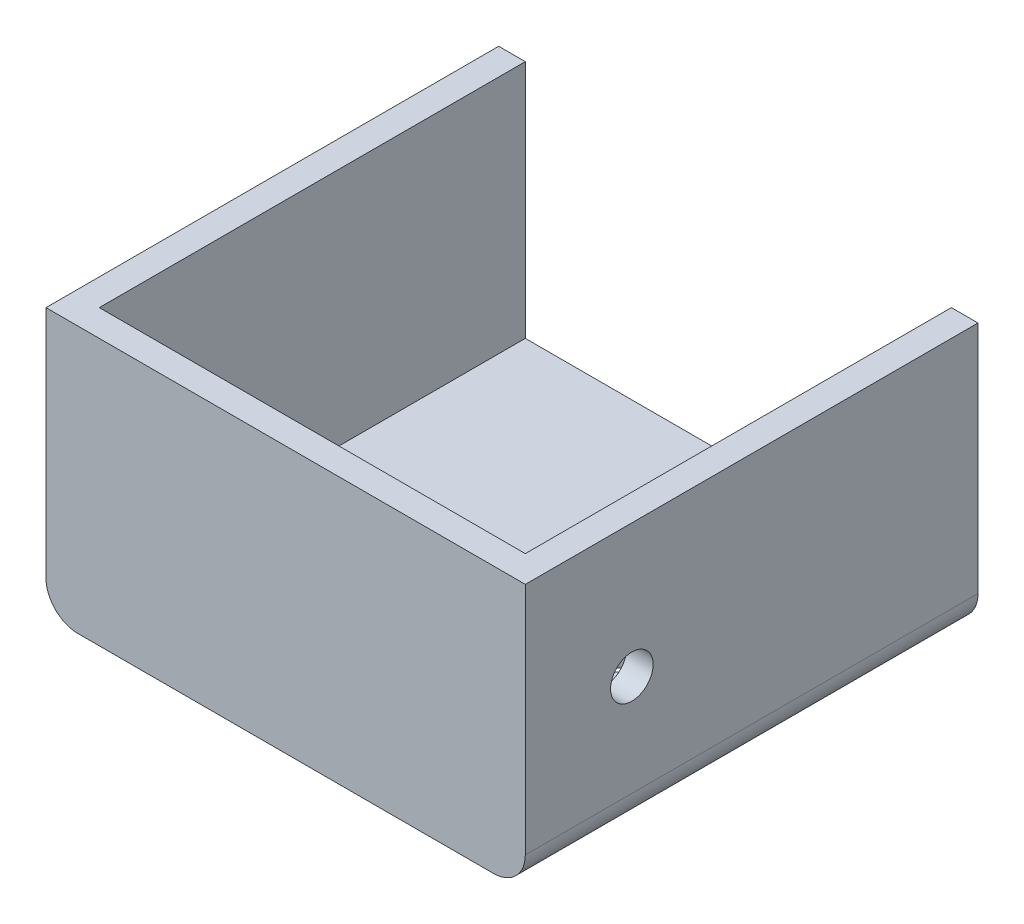
ISO-10303-21;
HEADER;
FILE_DESCRIPTION(('STEP AP214'),'2;1');
FILE_NAME('part.step','',(''),(''),'','','');
FILE_SCHEMA(('AUTOMOTIVE_DESIGN { 1 0 10303 214 1 1 1 1 }'));
ENDSEC;
DATA;
#1=APPLICATION_CONTEXT('core data for automotive mechanical design processes');
#2=APPLICATION_PROTOCOL_DEFINITION('international standard','automotive_design',2000,#1);
#3=PRODUCT_CONTEXT('',#1,'mechanical');
#4=PRODUCT('Part','Part','',(#3));
#5=PRODUCT_RELATED_PRODUCT_CATEGORY('part','',(#4));
#6=PRODUCT_DEFINITION_FORMATION('','',#4);
#7=PRODUCT_DEFINITION_CONTEXT('part definition',#1,'design');
#8=PRODUCT_DEFINITION('design','',#6,#7);
#9=PRODUCT_DEFINITION_SHAPE('','',#8);
#10=(LENGTH_UNIT() NAMED_UNIT(*) SI_UNIT(.MILLI.,.METRE.));
#11=(NAMED_UNIT(*) PLANE_ANGLE_UNIT() SI_UNIT($,.RADIAN.));
#12=(NAMED_UNIT(*) SI_UNIT($,.STERADIAN.) SOLID_ANGLE_UNIT());
#13=UNCERTAINTY_MEASURE_WITH_UNIT(LENGTH_MEASURE(1.E-05),#10,'distance_accuracy_value','');
#14=(GEOMETRIC_REPRESENTATION_CONTEXT(3) GLOBAL_UNCERTAINTY_ASSIGNED_CONTEXT((#13)) GLOBAL_UNIT_ASSIGNED_CONTEXT((#10,
#11,#12)) REPRESENTATION_CONTEXT('',''));
#15=CARTESIAN_POINT('',(0.,0.,0.));
#16=DIRECTION('',(0.,0.,1.));
#17=DIRECTION('',(1.,0.,0.));
#18=AXIS2_PLACEMENT_3D('',#15,#16,#17);
#19=CARTESIAN_POINT('',(22.5,-12.5,-2.5));
#20=DIRECTION('',(1.,0.,0.));
#21=DIRECTION('',(0.,0.,-1.));
#22=AXIS2_PLACEMENT_3D('',#19,#20,#21);
#23=PLANE('',#22);
#24=CARTESIAN_POINT('',(22.5,0.,-10.));
#25=DIRECTION('',(1.,0.,0.));
#26=DIRECTION('',(0.,0.,-1.));
#27=AXIS2_PLACEMENT_3D('',#24,#25,#26);
#28=CIRCLE('',#27,2.);
#29=CARTESIAN_POINT('',(22.5,0.,-12.));
#30=VERTEX_POINT('',#29);
#31=EDGE_CURVE('E195',#30,#30,#28,.T.);
#32=ORIENTED_EDGE('',*,*,#31,.F.);
#33=EDGE_LOOP('',(#32));
#34=FACE_BOUND('',#33,.T.);
#35=DIRECTION('',(0.,1.,0.));
#36=VECTOR('',#35,1.);
#37=CARTESIAN_POINT('',(22.5,-12.5,0.));
#38=LINE('',#37,#36);
#39=CARTESIAN_POINT('',(22.5,-9.5,0.));
#40=VERTEX_POINT('',#39);
#41=CARTESIAN_POINT('',(22.5,12.5,0.));
#42=VERTEX_POINT('',#41);
#43=EDGE_CURVE('E169',#40,#42,#38,.T.);
#44=ORIENTED_EDGE('',*,*,#43,.F.);
#45=DIRECTION('',(0.,0.,1.));
#46=VECTOR('',#45,1.);
#47=CARTESIAN_POINT('',(22.5,-9.5,-2.5));
#48=LINE('',#47,#46);
#49=CARTESIAN_POINT('',(22.5,-9.5,-42.5));
#50=VERTEX_POINT('',#49);
#51=EDGE_CURVE('E184',#40,#50,#48,.F.);
#52=ORIENTED_EDGE('',*,*,#51,.T.);
#53=DIRECTION('',(0.,-1.,0.));
#54=VECTOR('',#53,1.);
#55=CARTESIAN_POINT('',(22.5,-12.5,-42.5));
#56=LINE('',#55,#54);
#57=CARTESIAN_POINT('',(22.5,12.5,-42.5));
#58=VERTEX_POINT('',#57);
#59=EDGE_CURVE('E159',#58,#50,#56,.T.);
#60=ORIENTED_EDGE('',*,*,#59,.F.);
#61=DIRECTION('',(0.,0.,1.));
#62=VECTOR('',#61,1.);
#63=CARTESIAN_POINT('',(22.5,12.5,-2.5));
#64=LINE('',#63,#62);
#65=EDGE_CURVE('E129',#58,#42,#64,.T.);
#66=ORIENTED_EDGE('',*,*,#65,.T.);
#67=EDGE_LOOP('',(#44,#52,#60,#66));
#68=FACE_BOUND('',#67,.T.);
#69=ADVANCED_FACE('F32',(#34,#68),#23,.T.);
#70=CARTESIAN_POINT('',(-22.5,-12.5,-2.5));
#71=DIRECTION('',(0.,-1.,0.));
#72=DIRECTION('',(0.,0.,-1.));
#73=AXIS2_PLACEMENT_3D('',#70,#71,#72);
#74=PLANE('',#73);
#75=CARTESIAN_POINT('',(-10.,-12.5,-21.1));
#76=DIRECTION('',(0.,-1.,0.));
#77=DIRECTION('',(0.,0.,-1.));
#78=AXIS2_PLACEMENT_3D('',#75,#76,#77);
#79=CIRCLE('',#78,2.);
#80=CARTESIAN_POINT('',(-10.,-12.5,-23.1));
#81=VERTEX_POINT('',#80);
#82=EDGE_CURVE('E198',#81,#81,#79,.T.);
#83=ORIENTED_EDGE('',*,*,#82,.F.);
#84=EDGE_LOOP('',(#83));
#85=FACE_BOUND('',#84,.T.);
#86=CARTESIAN_POINT('',(10.,-12.5,-21.1));
#87=DIRECTION('',(0.,-1.,0.));
#88=DIRECTION('',(0.,0.,-1.));
#89=AXIS2_PLACEMENT_3D('',#86,#87,#88);
#90=CIRCLE('',#89,2.);
#91=CARTESIAN_POINT('',(10.,-12.5,-23.1));
#92=VERTEX_POINT('',#91);
#93=EDGE_CURVE('E203',#92,#92,#90,.T.);
#94=ORIENTED_EDGE('',*,*,#93,.F.);
#95=EDGE_LOOP('',(#94));
#96=FACE_BOUND('',#95,.T.);
#97=DIRECTION('',(1.,0.,0.));
#98=VECTOR('',#97,1.);
#99=CARTESIAN_POINT('',(-22.5,-12.5,0.));
#100=LINE('',#99,#98);
#101=CARTESIAN_POINT('',(-19.5,-12.5,0.));
#102=VERTEX_POINT('',#101);
#103=CARTESIAN_POINT('',(19.5,-12.5,0.));
#104=VERTEX_POINT('',#103);
#105=EDGE_CURVE('E172',#102,#104,#100,.T.);
#106=ORIENTED_EDGE('',*,*,#105,.F.);
#107=DIRECTION('',(0.,0.,1.));
#108=VECTOR('',#107,1.);
#109=CARTESIAN_POINT('',(-19.5,-12.5,-2.5));
#110=LINE('',#109,#108);
#111=CARTESIAN_POINT('',(-19.5,-12.5,-42.5));
#112=VERTEX_POINT('',#111);
#113=EDGE_CURVE('E41',#102,#112,#110,.F.);
#114=ORIENTED_EDGE('',*,*,#113,.T.);
#115=DIRECTION('',(-1.,0.,0.));
#116=VECTOR('',#115,1.);
#117=CARTESIAN_POINT('',(20.,-12.5,-42.5));
#118=LINE('',#117,#116);
#119=CARTESIAN_POINT('',(19.5,-12.5,-42.5));
#120=VERTEX_POINT('',#119);
#121=EDGE_CURVE('E119',#120,#112,#118,.T.);
#122=ORIENTED_EDGE('',*,*,#121,.F.);
#123=DIRECTION('',(0.,0.,1.));
#124=VECTOR('',#123,1.);
#125=CARTESIAN_POINT('',(19.5,-12.5,-2.5));
#126=LINE('',#125,#124);
#127=EDGE_CURVE('E128',#120,#104,#126,.T.);
#128=ORIENTED_EDGE('',*,*,#127,.T.);
#129=EDGE_LOOP('',(#106,#114,#122,#128));
#130=FACE_BOUND('',#129,.T.);
#131=ADVANCED_FACE('F231',(#85,#96,#130),#74,.T.);
#132=CARTESIAN_POINT('',(-22.5,-12.5,-2.5));
#133=DIRECTION('',(-1.,0.,0.));
#134=DIRECTION('',(0.,0.,1.));
#135=AXIS2_PLACEMENT_3D('',#132,#133,#134);
#136=PLANE('',#135);
#137=CARTESIAN_POINT('',(-22.5,0.,-10.));
#138=DIRECTION('',(-1.,0.,0.));
#139=DIRECTION('',(0.,0.,1.));
#140=AXIS2_PLACEMENT_3D('',#137,#138,#139);
#141=CIRCLE('',#140,2.);
#142=CARTESIAN_POINT('',(-22.5,0.,-8.));
#143=VERTEX_POINT('',#142);
#144=EDGE_CURVE('E153',#143,#143,#141,.T.);
#145=ORIENTED_EDGE('',*,*,#144,.F.);
#146=EDGE_LOOP('',(#145));
#147=FACE_BOUND('',#146,.T.);
#148=DIRECTION('',(0.,1.,0.));
#149=VECTOR('',#148,1.);
#150=CARTESIAN_POINT('',(-22.5,-12.5,-42.5));
#151=LINE('',#150,#149);
#152=CARTESIAN_POINT('',(-22.5,-9.5,-42.5));
#153=VERTEX_POINT('',#152);
#154=CARTESIAN_POINT('',(-22.5,12.5,-42.5));
#155=VERTEX_POINT('',#154);
#156=EDGE_CURVE('E109',#153,#155,#151,.T.);
#157=ORIENTED_EDGE('',*,*,#156,.F.);
#158=DIRECTION('',(0.,0.,1.));
#159=VECTOR('',#158,1.);
#160=CARTESIAN_POINT('',(-22.5,-9.5,-2.5));
#161=LINE('',#160,#159);
#162=CARTESIAN_POINT('',(-22.5,-9.5,0.));
#163=VERTEX_POINT('',#162);
#164=EDGE_CURVE('E188',#153,#163,#161,.T.);
#165=ORIENTED_EDGE('',*,*,#164,.T.);
#166=DIRECTION('',(0.,-1.,0.));
#167=VECTOR('',#166,1.);
#168=CARTESIAN_POINT('',(-22.5,-12.5,0.));
#169=LINE('',#168,#167);
#170=CARTESIAN_POINT('',(-22.5,12.5,0.));
#171=VERTEX_POINT('',#170);
#172=EDGE_CURVE('E124',#171,#163,#169,.T.);
#173=ORIENTED_EDGE('',*,*,#172,.F.);
#174=DIRECTION('',(0.,0.,1.));
#175=VECTOR('',#174,1.);
#176=CARTESIAN_POINT('',(-22.5,12.5,-2.5));
#177=LINE('',#176,#175);
#178=EDGE_CURVE('E122',#155,#171,#177,.T.);
#179=ORIENTED_EDGE('',*,*,#178,.F.);
#180=EDGE_LOOP('',(#157,#165,#173,#179));
#181=FACE_BOUND('',#180,.T.);
#182=ADVANCED_FACE('F123',(#147,#181),#136,.T.);
#183=CARTESIAN_POINT('',(-22.5,12.5,-2.5));
#184=DIRECTION('',(0.,1.,0.));
#185=DIRECTION('',(0.,0.,1.));
#186=AXIS2_PLACEMENT_3D('',#183,#184,#185);
#187=PLANE('',#186);
#188=DIRECTION('',(-1.,0.,0.));
#189=VECTOR('',#188,1.);
#190=CARTESIAN_POINT('',(-22.5,12.5,0.));
#191=LINE('',#190,#189);
#192=EDGE_CURVE('E174',#42,#171,#191,.T.);
#193=ORIENTED_EDGE('',*,*,#192,.F.);
#194=ORIENTED_EDGE('',*,*,#65,.F.);
#195=DIRECTION('',(1.,0.,0.));
#196=VECTOR('',#195,1.);
#197=CARTESIAN_POINT('',(22.5,12.5,-42.5));
#198=LINE('',#197,#196);
#199=CARTESIAN_POINT('',(20.,12.5,-42.5));
#200=VERTEX_POINT('',#199);
#201=EDGE_CURVE('E145',#200,#58,#198,.T.);
#202=ORIENTED_EDGE('',*,*,#201,.F.);
#203=DIRECTION('',(0.,0.,1.));
#204=VECTOR('',#203,1.);
#205=CARTESIAN_POINT('',(20.,12.5,-42.5));
#206=LINE('',#205,#204);
#207=CARTESIAN_POINT('',(20.,12.5,-2.5));
#208=VERTEX_POINT('',#207);
#209=EDGE_CURVE('E148',#200,#208,#206,.T.);
#210=ORIENTED_EDGE('',*,*,#209,.T.);
#211=DIRECTION('',(-1.,0.,0.));
#212=VECTOR('',#211,1.);
#213=CARTESIAN_POINT('',(-22.5,12.5,-2.5));
#214=LINE('',#213,#212);
#215=CARTESIAN_POINT('',(-20.,12.5,-2.5));
#216=VERTEX_POINT('',#215);
#217=EDGE_CURVE('E170',#208,#216,#214,.T.);
#218=ORIENTED_EDGE('',*,*,#217,.T.);
#219=DIRECTION('',(0.,0.,1.));
#220=VECTOR('',#219,1.);
#221=CARTESIAN_POINT('',(-20.,12.5,-42.5));
#222=LINE('',#221,#220);
#223=CARTESIAN_POINT('',(-20.,12.5,-42.5));
#224=VERTEX_POINT('',#223);
#225=EDGE_CURVE('E134',#224,#216,#222,.T.);
#226=ORIENTED_EDGE('',*,*,#225,.F.);
#227=DIRECTION('',(1.,0.,0.));
#228=VECTOR('',#227,1.);
#229=CARTESIAN_POINT('',(-22.5,12.5,-42.5));
#230=LINE('',#229,#228);
#231=EDGE_CURVE('E113',#155,#224,#230,.T.);
#232=ORIENTED_EDGE('',*,*,#231,.F.);
#233=ORIENTED_EDGE('',*,*,#178,.T.);
#234=EDGE_LOOP('',(#193,#194,#202,#210,#218,#226,#232,#233));
#235=FACE_BOUND('',#234,.T.);
#236=ADVANCED_FACE('F131',(#235),#187,.T.);
#237=CARTESIAN_POINT('',(0.,0.,-2.5));
#238=DIRECTION('',(0.,0.,-1.));
#239=DIRECTION('',(-1.,0.,0.));
#240=AXIS2_PLACEMENT_3D('',#237,#238,#239);
#241=PLANE('',#240);
#242=DIRECTION('',(0.,1.,0.));
#243=VECTOR('',#242,1.);
#244=CARTESIAN_POINT('',(20.,12.5,-2.5));
#245=LINE('',#244,#243);
#246=CARTESIAN_POINT('',(20.,-10.,-2.5));
#247=VERTEX_POINT('',#246);
#248=EDGE_CURVE('E156',#247,#208,#245,.T.);
#249=ORIENTED_EDGE('',*,*,#248,.F.);
#250=DIRECTION('',(1.,0.,0.));
#251=VECTOR('',#250,1.);
#252=CARTESIAN_POINT('',(20.,-10.,-2.5));
#253=LINE('',#252,#251);
#254=CARTESIAN_POINT('',(-20.,-10.,-2.5));
#255=VERTEX_POINT('',#254);
#256=EDGE_CURVE('E152',#255,#247,#253,.T.);
#257=ORIENTED_EDGE('',*,*,#256,.F.);
#258=DIRECTION('',(0.,-1.,0.));
#259=VECTOR('',#258,1.);
#260=CARTESIAN_POINT('',(-20.,12.5,-2.5));
#261=LINE('',#260,#259);
#262=EDGE_CURVE('E149',#216,#255,#261,.T.);
#263=ORIENTED_EDGE('',*,*,#262,.F.);
#264=ORIENTED_EDGE('',*,*,#217,.F.);
#265=EDGE_LOOP('',(#249,#257,#263,#264));
#266=FACE_BOUND('',#265,.T.);
#267=ADVANCED_FACE('F248',(#266),#241,.T.);
#268=CARTESIAN_POINT('',(0.,0.,0.));
#269=DIRECTION('',(0.,0.,-1.));
#270=DIRECTION('',(-1.,0.,0.));
#271=AXIS2_PLACEMENT_3D('',#268,#269,#270);
#272=PLANE('',#271);
#273=ORIENTED_EDGE('',*,*,#172,.T.);
#274=CARTESIAN_POINT('',(-19.5,-9.5,0.));
#275=DIRECTION('',(0.,0.,-1.));
#276=DIRECTION('',(-1.,0.,0.));
#277=AXIS2_PLACEMENT_3D('',#274,#275,#276);
#278=CIRCLE('',#277,3.);
#279=EDGE_CURVE('E56',#163,#102,#278,.F.);
#280=ORIENTED_EDGE('',*,*,#279,.T.);
#281=ORIENTED_EDGE('',*,*,#105,.T.);
#282=CARTESIAN_POINT('',(19.5,-9.5,0.));
#283=DIRECTION('',(0.,0.,-1.));
#284=DIRECTION('',(-1.,0.,0.));
#285=AXIS2_PLACEMENT_3D('',#282,#283,#284);
#286=CIRCLE('',#285,3.);
#287=EDGE_CURVE('E182',#104,#40,#286,.F.);
#288=ORIENTED_EDGE('',*,*,#287,.T.);
#289=ORIENTED_EDGE('',*,*,#43,.T.);
#290=ORIENTED_EDGE('',*,*,#192,.T.);
#291=EDGE_LOOP('',(#273,#280,#281,#288,#289,#290));
#292=FACE_BOUND('',#291,.T.);
#293=ADVANCED_FACE('F220',(#292),#272,.F.);
#294=CARTESIAN_POINT('',(-20.,12.5,-42.5));
#295=DIRECTION('',(-1.,0.,0.));
#296=DIRECTION('',(0.,-1.,0.));
#297=AXIS2_PLACEMENT_3D('',#294,#295,#296);
#298=PLANE('',#297);
#299=CARTESIAN_POINT('',(-20.,0.,-10.));
#300=DIRECTION('',(-1.,0.,0.));
#301=DIRECTION('',(0.,-1.,0.));
#302=AXIS2_PLACEMENT_3D('',#299,#300,#301);
#303=CIRCLE('',#302,2.);
#304=CARTESIAN_POINT('',(-20.,-2.,-10.));
#305=VERTEX_POINT('',#304);
#306=EDGE_CURVE('E194',#305,#305,#303,.T.);
#307=ORIENTED_EDGE('',*,*,#306,.T.);
#308=EDGE_LOOP('',(#307));
#309=FACE_BOUND('',#308,.T.);
#310=ORIENTED_EDGE('',*,*,#262,.T.);
#311=DIRECTION('',(0.,0.,1.));
#312=VECTOR('',#311,1.);
#313=CARTESIAN_POINT('',(-20.,-10.,-42.5));
#314=LINE('',#313,#312);
#315=CARTESIAN_POINT('',(-20.,-10.,-42.5));
#316=VERTEX_POINT('',#315);
#317=EDGE_CURVE('E165',#316,#255,#314,.T.);
#318=ORIENTED_EDGE('',*,*,#317,.F.);
#319=DIRECTION('',(0.,-1.,0.));
#320=VECTOR('',#319,1.);
#321=CARTESIAN_POINT('',(-20.,12.5,-42.5));
#322=LINE('',#321,#320);
#323=EDGE_CURVE('E136',#224,#316,#322,.T.);
#324=ORIENTED_EDGE('',*,*,#323,.F.);
#325=ORIENTED_EDGE('',*,*,#225,.T.);
#326=EDGE_LOOP('',(#310,#318,#324,#325));
#327=FACE_BOUND('',#326,.T.);
#328=ADVANCED_FACE('F269',(#309,#327),#298,.F.);
#329=CARTESIAN_POINT('',(20.,-10.,-42.5));
#330=DIRECTION('',(0.,-1.,0.));
#331=DIRECTION('',(0.,0.,-1.));
#332=AXIS2_PLACEMENT_3D('',#329,#330,#331);
#333=PLANE('',#332);
#334=CARTESIAN_POINT('',(-10.,-10.,-21.1));
#335=DIRECTION('',(0.,-1.,0.));
#336=DIRECTION('',(0.,0.,-1.));
#337=AXIS2_PLACEMENT_3D('',#334,#335,#336);
#338=CIRCLE('',#337,2.);
#339=CARTESIAN_POINT('',(-10.,-10.,-23.1));
#340=VERTEX_POINT('',#339);
#341=EDGE_CURVE('E36',#340,#340,#338,.T.);
#342=ORIENTED_EDGE('',*,*,#341,.T.);
#343=EDGE_LOOP('',(#342));
#344=FACE_BOUND('',#343,.T.);
#345=CARTESIAN_POINT('',(10.,-10.,-21.1));
#346=DIRECTION('',(0.,-1.,0.));
#347=DIRECTION('',(0.,0.,-1.));
#348=AXIS2_PLACEMENT_3D('',#345,#346,#347);
#349=CIRCLE('',#348,2.);
#350=CARTESIAN_POINT('',(10.,-10.,-23.1));
#351=VERTEX_POINT('',#350);
#352=EDGE_CURVE('E196',#351,#351,#349,.T.);
#353=ORIENTED_EDGE('',*,*,#352,.T.);
#354=EDGE_LOOP('',(#353));
#355=FACE_BOUND('',#354,.T.);
#356=ORIENTED_EDGE('',*,*,#256,.T.);
#357=DIRECTION('',(0.,0.,1.));
#358=VECTOR('',#357,1.);
#359=CARTESIAN_POINT('',(20.,-10.,-42.5));
#360=LINE('',#359,#358);
#361=CARTESIAN_POINT('',(20.,-10.,-42.5));
#362=VERTEX_POINT('',#361);
#363=EDGE_CURVE('E162',#362,#247,#360,.T.);
#364=ORIENTED_EDGE('',*,*,#363,.F.);
#365=DIRECTION('',(1.,0.,0.));
#366=VECTOR('',#365,1.);
#367=CARTESIAN_POINT('',(20.,-10.,-42.5));
#368=LINE('',#367,#366);
#369=EDGE_CURVE('E138',#316,#362,#368,.T.);
#370=ORIENTED_EDGE('',*,*,#369,.F.);
#371=ORIENTED_EDGE('',*,*,#317,.T.);
#372=EDGE_LOOP('',(#356,#364,#370,#371));
#373=FACE_BOUND('',#372,.T.);
#374=ADVANCED_FACE('F260',(#344,#355,#373),#333,.F.);
#375=CARTESIAN_POINT('',(20.,12.5,-42.5));
#376=DIRECTION('',(1.,0.,0.));
#377=DIRECTION('',(0.,1.,0.));
#378=AXIS2_PLACEMENT_3D('',#375,#376,#377);
#379=PLANE('',#378);
#380=CARTESIAN_POINT('',(20.,0.,-10.));
#381=DIRECTION('',(1.,0.,0.));
#382=DIRECTION('',(0.,1.,0.));
#383=AXIS2_PLACEMENT_3D('',#380,#381,#382);
#384=CIRCLE('',#383,2.);
#385=CARTESIAN_POINT('',(20.,2.,-10.));
#386=VERTEX_POINT('',#385);
#387=EDGE_CURVE('E192',#386,#386,#384,.T.);
#388=ORIENTED_EDGE('',*,*,#387,.T.);
#389=EDGE_LOOP('',(#388));
#390=FACE_BOUND('',#389,.T.);
#391=ORIENTED_EDGE('',*,*,#248,.T.);
#392=ORIENTED_EDGE('',*,*,#209,.F.);
#393=DIRECTION('',(0.,1.,0.));
#394=VECTOR('',#393,1.);
#395=CARTESIAN_POINT('',(20.,12.5,-42.5));
#396=LINE('',#395,#394);
#397=EDGE_CURVE('E143',#362,#200,#396,.T.);
#398=ORIENTED_EDGE('',*,*,#397,.F.);
#399=ORIENTED_EDGE('',*,*,#363,.T.);
#400=EDGE_LOOP('',(#391,#392,#398,#399));
#401=FACE_BOUND('',#400,.T.);
#402=ADVANCED_FACE('F255',(#390,#401),#379,.F.);
#403=CARTESIAN_POINT('',(0.,0.,-42.5));
#404=DIRECTION('',(0.,0.,1.));
#405=DIRECTION('',(1.,0.,0.));
#406=AXIS2_PLACEMENT_3D('',#403,#404,#405);
#407=PLANE('',#406);
#408=ORIENTED_EDGE('',*,*,#121,.T.);
#409=CARTESIAN_POINT('',(-19.5,-9.5,-42.5));
#410=DIRECTION('',(0.,0.,1.));
#411=DIRECTION('',(1.,0.,0.));
#412=AXIS2_PLACEMENT_3D('',#409,#410,#411);
#413=CIRCLE('',#412,3.);
#414=EDGE_CURVE('E11',#112,#153,#413,.F.);
#415=ORIENTED_EDGE('',*,*,#414,.T.);
#416=ORIENTED_EDGE('',*,*,#156,.T.);
#417=ORIENTED_EDGE('',*,*,#231,.T.);
#418=ORIENTED_EDGE('',*,*,#323,.T.);
#419=ORIENTED_EDGE('',*,*,#369,.T.);
#420=ORIENTED_EDGE('',*,*,#397,.T.);
#421=ORIENTED_EDGE('',*,*,#201,.T.);
#422=ORIENTED_EDGE('',*,*,#59,.T.);
#423=CARTESIAN_POINT('',(19.5,-9.5,-42.5));
#424=DIRECTION('',(0.,0.,1.));
#425=DIRECTION('',(1.,0.,0.));
#426=AXIS2_PLACEMENT_3D('',#423,#424,#425);
#427=CIRCLE('',#426,3.);
#428=EDGE_CURVE('E186',#50,#120,#427,.F.);
#429=ORIENTED_EDGE('',*,*,#428,.T.);
#430=EDGE_LOOP('',(#408,#415,#416,#417,#418,#419,#420,#421,#422,#429));
#431=FACE_BOUND('',#430,.T.);
#432=ADVANCED_FACE('F111',(#431),#407,.F.);
#433=CARTESIAN_POINT('',(19.5,-9.5,-2.5));
#434=DIRECTION('',(0.,0.,1.));
#435=DIRECTION('',(1.,0.,0.));
#436=AXIS2_PLACEMENT_3D('',#433,#434,#435);
#437=CYLINDRICAL_SURFACE('',#436,3.);
#438=ORIENTED_EDGE('',*,*,#428,.F.);
#439=ORIENTED_EDGE('',*,*,#51,.F.);
#440=ORIENTED_EDGE('',*,*,#287,.F.);
#441=ORIENTED_EDGE('',*,*,#127,.F.);
#442=EDGE_LOOP('',(#438,#439,#440,#441));
#443=FACE_BOUND('',#442,.T.);
#444=ADVANCED_FACE('F230',(#443),#437,.T.);
#445=CARTESIAN_POINT('',(-19.5,-9.5,-2.5));
#446=DIRECTION('',(0.,0.,1.));
#447=DIRECTION('',(1.,0.,0.));
#448=AXIS2_PLACEMENT_3D('',#445,#446,#447);
#449=CYLINDRICAL_SURFACE('',#448,3.);
#450=ORIENTED_EDGE('',*,*,#414,.F.);
#451=ORIENTED_EDGE('',*,*,#113,.F.);
#452=ORIENTED_EDGE('',*,*,#279,.F.);
#453=ORIENTED_EDGE('',*,*,#164,.F.);
#454=EDGE_LOOP('',(#450,#451,#452,#453));
#455=FACE_BOUND('',#454,.T.);
#456=ADVANCED_FACE('F34',(#455),#449,.T.);
#457=CARTESIAN_POINT('',(-77.5,0.,-10.));
#458=DIRECTION('',(1.,0.,0.));
#459=DIRECTION('',(0.,0.,-1.));
#460=AXIS2_PLACEMENT_3D('',#457,#458,#459);
#461=CYLINDRICAL_SURFACE('',#460,2.);
#462=ORIENTED_EDGE('',*,*,#31,.T.);
#463=EDGE_LOOP('',(#462));
#464=FACE_BOUND('',#463,.T.);
#465=ORIENTED_EDGE('',*,*,#387,.F.);
#466=EDGE_LOOP('',(#465));
#467=FACE_BOUND('',#466,.T.);
#468=ADVANCED_FACE('F254',(#464,#467),#461,.F.);
#469=ORIENTED_EDGE('',*,*,#144,.T.);
#470=EDGE_LOOP('',(#469));
#471=FACE_BOUND('',#470,.T.);
#472=ORIENTED_EDGE('',*,*,#306,.F.);
#473=EDGE_LOOP('',(#472));
#474=FACE_BOUND('',#473,.T.);
#475=ADVANCED_FACE('F264',(#471,#474),#461,.F.);
#476=CARTESIAN_POINT('',(10.,27.5,-21.1));
#477=DIRECTION('',(0.,-1.,0.));
#478=DIRECTION('',(0.,0.,-1.));
#479=AXIS2_PLACEMENT_3D('',#476,#477,#478);
#480=CYLINDRICAL_SURFACE('',#479,2.);
#481=ORIENTED_EDGE('',*,*,#93,.T.);
#482=EDGE_LOOP('',(#481));
#483=FACE_BOUND('',#482,.T.);
#484=ORIENTED_EDGE('',*,*,#352,.F.);
#485=EDGE_LOOP('',(#484));
#486=FACE_BOUND('',#485,.T.);
#487=ADVANCED_FACE('F318',(#483,#486),#480,.F.);
#488=CARTESIAN_POINT('',(-10.,27.5,-21.1));
#489=DIRECTION('',(0.,-1.,0.));
#490=DIRECTION('',(0.,0.,-1.));
#491=AXIS2_PLACEMENT_3D('',#488,#489,#490);
#492=CYLINDRICAL_SURFACE('',#491,2.);
#493=ORIENTED_EDGE('',*,*,#82,.T.);
#494=EDGE_LOOP('',(#493));
#495=FACE_BOUND('',#494,.T.);
#496=ORIENTED_EDGE('',*,*,#341,.F.);
#497=EDGE_LOOP('',(#496));
#498=FACE_BOUND('',#497,.T.);
#499=ADVANCED_FACE('F391',(#495,#498),#492,.F.);
#500=CLOSED_SHELL('',(#69,#131,#182,#236,#267,#293,#328,#374,#402,#432,#444,#456,#468,#475,#487,#499));
#501=MANIFOLD_SOLID_BREP('B2',#500);
#502=ADVANCED_BREP_SHAPE_REPRESENTATION('',(#18,#501),#14);
#503=SHAPE_DEFINITION_REPRESENTATION(#9,#502);
ENDSEC;
END-ISO-10303-21;
